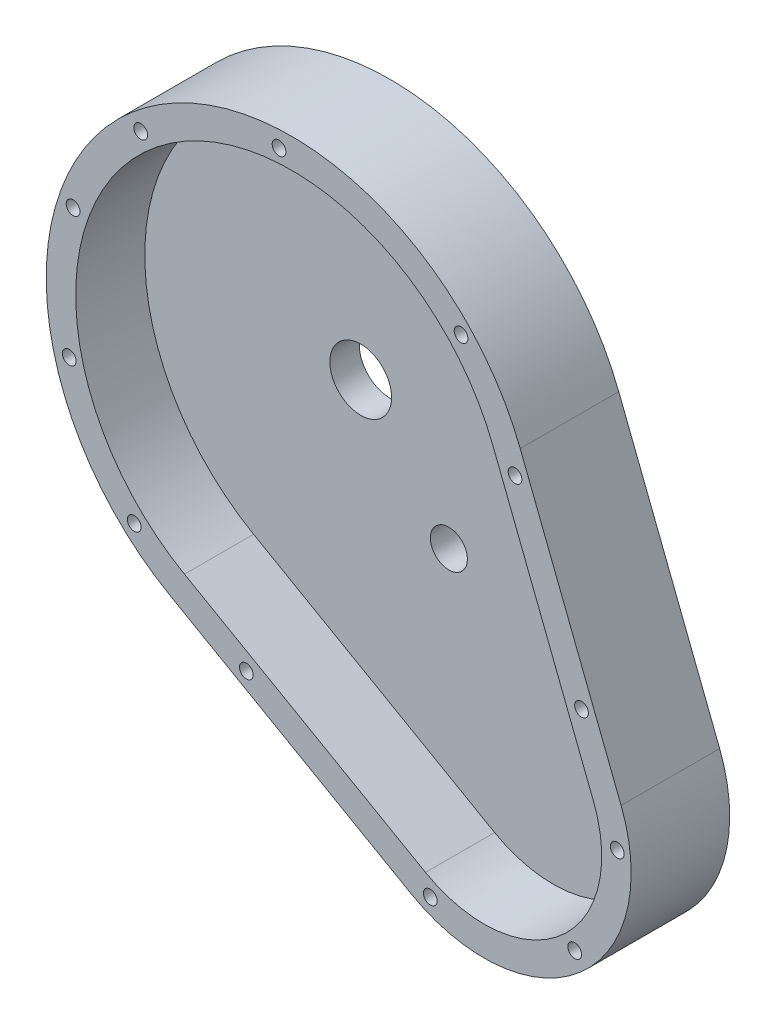
ISO-10303-21;
HEADER;
FILE_DESCRIPTION(('STEP AP214'),'2;1');
FILE_NAME('part.step','',(''),(''),'','','');
FILE_SCHEMA(('AUTOMOTIVE_DESIGN { 1 0 10303 214 1 1 1 1 }'));
ENDSEC;
DATA;
#1=APPLICATION_CONTEXT('core data for automotive mechanical design processes');
#2=APPLICATION_PROTOCOL_DEFINITION('international standard','automotive_design',2000,#1);
#3=PRODUCT_CONTEXT('',#1,'mechanical');
#4=PRODUCT('Part','Part','',(#3));
#5=PRODUCT_RELATED_PRODUCT_CATEGORY('part','',(#4));
#6=PRODUCT_DEFINITION_FORMATION('','',#4);
#7=PRODUCT_DEFINITION_CONTEXT('part definition',#1,'design');
#8=PRODUCT_DEFINITION('design','',#6,#7);
#9=PRODUCT_DEFINITION_SHAPE('','',#8);
#10=(LENGTH_UNIT() NAMED_UNIT(*) SI_UNIT(.MILLI.,.METRE.));
#11=(NAMED_UNIT(*) PLANE_ANGLE_UNIT() SI_UNIT($,.RADIAN.));
#12=(NAMED_UNIT(*) SI_UNIT($,.STERADIAN.) SOLID_ANGLE_UNIT());
#13=UNCERTAINTY_MEASURE_WITH_UNIT(LENGTH_MEASURE(1.E-05),#10,'distance_accuracy_value','');
#14=(GEOMETRIC_REPRESENTATION_CONTEXT(3) GLOBAL_UNCERTAINTY_ASSIGNED_CONTEXT((#13)) GLOBAL_UNIT_ASSIGNED_CONTEXT((#10,
#11,#12)) REPRESENTATION_CONTEXT('',''));
#15=CARTESIAN_POINT('',(0.,0.,0.));
#16=DIRECTION('',(0.,0.,1.));
#17=DIRECTION('',(1.,0.,0.));
#18=AXIS2_PLACEMENT_3D('',#15,#16,#17);
#19=CARTESIAN_POINT('',(15.7540834815016,27.5657641587872,12.7508));
#20=DIRECTION('',(0.,0.,-1.));
#21=DIRECTION('',(-1.,0.,0.));
#22=AXIS2_PLACEMENT_3D('',#19,#20,#21);
#23=CYLINDRICAL_SURFACE('',#22,31.75);
#24=CARTESIAN_POINT('',(15.7540834815016,27.5657641587872,0.));
#25=DIRECTION('',(0.,0.,1.));
#26=DIRECTION('',(1.,0.,0.));
#27=AXIS2_PLACEMENT_3D('',#24,#25,#26);
#28=CIRCLE('',#27,31.75);
#29=CARTESIAN_POINT('',(45.3334273140184,39.1037413834896,0.));
#30=VERTEX_POINT('',#29);
#31=CARTESIAN_POINT('',(0.,0.,0.));
#32=VERTEX_POINT('',#31);
#33=EDGE_CURVE('E173',#30,#32,#28,.T.);
#34=ORIENTED_EDGE('',*,*,#33,.T.);
#35=DIRECTION('',(0.,0.,-1.));
#36=VECTOR('',#35,1.);
#37=CARTESIAN_POINT('',(0.,0.,12.7508));
#38=LINE('',#37,#36);
#39=CARTESIAN_POINT('',(0.,0.,12.7508));
#40=VERTEX_POINT('',#39);
#41=EDGE_CURVE('E11',#40,#32,#38,.T.);
#42=ORIENTED_EDGE('',*,*,#41,.F.);
#43=CARTESIAN_POINT('',(15.7540834815016,27.5657641587872,12.7508));
#44=DIRECTION('',(0.,0.,1.));
#45=DIRECTION('',(1.,0.,0.));
#46=AXIS2_PLACEMENT_3D('',#43,#44,#45);
#47=CIRCLE('',#46,31.75);
#48=CARTESIAN_POINT('',(45.3334273140184,39.1037413834896,12.7508));
#49=VERTEX_POINT('',#48);
#50=EDGE_CURVE('E162',#49,#40,#47,.T.);
#51=ORIENTED_EDGE('',*,*,#50,.F.);
#52=DIRECTION('',(0.,0.,-1.));
#53=VECTOR('',#52,1.);
#54=CARTESIAN_POINT('',(45.3334273140184,39.1037413834896,12.7508));
#55=LINE('',#54,#53);
#56=EDGE_CURVE('E172',#49,#30,#55,.T.);
#57=ORIENTED_EDGE('',*,*,#56,.T.);
#58=EDGE_LOOP('',(#34,#42,#51,#57));
#59=FACE_BOUND('',#58,.T.);
#60=ADVANCED_FACE('F45',(#59),#23,.T.);
#61=CARTESIAN_POINT('',(0.,0.,12.7508));
#62=DIRECTION('',(0.496191605716585,0.868213044371252,0.));
#63=DIRECTION('',(-0.868213044371252,0.496191605716585,0.));
#64=AXIS2_PLACEMENT_3D('',#61,#62,#63);
#65=PLANE('',#64);
#66=DIRECTION('',(0.868213044371252,-0.496191605716584,0.));
#67=VECTOR('',#66,1.);
#68=CARTESIAN_POINT('',(0.,0.,0.));
#69=LINE('',#68,#67);
#70=CARTESIAN_POINT('',(31.1871020244281,-17.823710817838,0.));
#71=VERTEX_POINT('',#70);
#72=EDGE_CURVE('E177',#32,#71,#69,.T.);
#73=ORIENTED_EDGE('',*,*,#72,.T.);
#74=DIRECTION('',(0.,0.,-1.));
#75=VECTOR('',#74,1.);
#76=CARTESIAN_POINT('',(31.1871020244281,-17.823710817838,12.7508));
#77=LINE('',#76,#75);
#78=CARTESIAN_POINT('',(31.1871020244281,-17.823710817838,12.7508));
#79=VERTEX_POINT('',#78);
#80=EDGE_CURVE('E53',#79,#71,#77,.T.);
#81=ORIENTED_EDGE('',*,*,#80,.F.);
#82=DIRECTION('',(0.868213044371252,-0.496191605716584,0.));
#83=VECTOR('',#82,1.);
#84=CARTESIAN_POINT('',(0.,0.,12.7508));
#85=LINE('',#84,#83);
#86=EDGE_CURVE('E97',#40,#79,#85,.T.);
#87=ORIENTED_EDGE('',*,*,#86,.F.);
#88=ORIENTED_EDGE('',*,*,#41,.T.);
#89=EDGE_LOOP('',(#73,#81,#87,#88));
#90=FACE_BOUND('',#89,.T.);
#91=ADVANCED_FACE('F212',(#90),#65,.F.);
#92=CARTESIAN_POINT('',(40.639552113329,-1.28425232256561,12.7508));
#93=DIRECTION('',(0.,0.,-1.));
#94=DIRECTION('',(-1.,0.,0.));
#95=AXIS2_PLACEMENT_3D('',#92,#93,#94);
#96=CYLINDRICAL_SURFACE('',#95,19.05);
#97=CARTESIAN_POINT('',(40.639552113329,-1.28425232256561,0.));
#98=DIRECTION('',(0.,0.,1.));
#99=DIRECTION('',(1.,0.,0.));
#100=AXIS2_PLACEMENT_3D('',#97,#98,#99);
#101=CIRCLE('',#100,19.05);
#102=CARTESIAN_POINT('',(58.3871584128391,5.63853401225579,0.));
#103=VERTEX_POINT('',#102);
#104=EDGE_CURVE('E180',#71,#103,#101,.T.);
#105=ORIENTED_EDGE('',*,*,#104,.T.);
#106=DIRECTION('',(0.,0.,-1.));
#107=VECTOR('',#106,1.);
#108=CARTESIAN_POINT('',(58.3871584128391,5.63853401225579,12.7508));
#109=LINE('',#108,#107);
#110=CARTESIAN_POINT('',(58.3871584128391,5.63853401225579,12.7508));
#111=VERTEX_POINT('',#110);
#112=EDGE_CURVE('E187',#111,#103,#109,.T.);
#113=ORIENTED_EDGE('',*,*,#112,.F.);
#114=CARTESIAN_POINT('',(40.639552113329,-1.28425232256561,12.7508));
#115=DIRECTION('',(0.,0.,1.));
#116=DIRECTION('',(1.,0.,0.));
#117=AXIS2_PLACEMENT_3D('',#114,#115,#116);
#118=CIRCLE('',#117,19.05);
#119=EDGE_CURVE('E167',#79,#111,#118,.T.);
#120=ORIENTED_EDGE('',*,*,#119,.F.);
#121=ORIENTED_EDGE('',*,*,#80,.T.);
#122=EDGE_LOOP('',(#105,#113,#120,#121));
#123=FACE_BOUND('',#122,.T.);
#124=ADVANCED_FACE('F194',(#123),#96,.T.);
#125=CARTESIAN_POINT('',(58.3871584128391,5.63853401225578,12.7508));
#126=DIRECTION('',(-0.931632876614703,-0.363400857470939,0.));
#127=DIRECTION('',(0.363400857470939,-0.931632876614703,0.));
#128=AXIS2_PLACEMENT_3D('',#125,#126,#127);
#129=PLANE('',#128);
#130=DIRECTION('',(-0.363400857470939,0.931632876614703,0.));
#131=VECTOR('',#130,1.);
#132=CARTESIAN_POINT('',(58.3871584128391,5.63853401225578,0.));
#133=LINE('',#132,#131);
#134=EDGE_CURVE('E90',#103,#30,#133,.T.);
#135=ORIENTED_EDGE('',*,*,#134,.T.);
#136=ORIENTED_EDGE('',*,*,#56,.F.);
#137=DIRECTION('',(-0.363400857470939,0.931632876614703,0.));
#138=VECTOR('',#137,1.);
#139=CARTESIAN_POINT('',(58.3871584128391,5.63853401225578,12.7508));
#140=LINE('',#139,#138);
#141=EDGE_CURVE('E69',#111,#49,#140,.T.);
#142=ORIENTED_EDGE('',*,*,#141,.F.);
#143=ORIENTED_EDGE('',*,*,#112,.T.);
#144=EDGE_LOOP('',(#135,#136,#142,#143));
#145=FACE_BOUND('',#144,.T.);
#146=ADVANCED_FACE('F202',(#145),#129,.F.);
#147=CARTESIAN_POINT('',(15.7540834815016,27.5657641587872,12.7508));
#148=DIRECTION('',(0.,0.,1.));
#149=DIRECTION('',(1.,0.,0.));
#150=AXIS2_PLACEMENT_3D('',#147,#148,#149);
#151=PLANE('',#150);
#152=CARTESIAN_POINT('',(-3.77016974643415,50.098384989217,12.7508));
#153=DIRECTION('',(0.,0.,1.));
#154=DIRECTION('',(1.,0.,0.));
#155=AXIS2_PLACEMENT_3D('',#152,#153,#154);
#156=CIRCLE('',#155,0.888999999999987);
#157=CARTESIAN_POINT('',(-2.88116974643417,50.098384989217,12.7508));
#158=VERTEX_POINT('',#157);
#159=EDGE_CURVE('E504',#158,#158,#156,.T.);
#160=ORIENTED_EDGE('',*,*,#159,.F.);
#161=EDGE_LOOP('',(#160));
#162=FACE_BOUND('',#161,.T.);
#163=CARTESIAN_POINT('',(14.1273033168311,57.178704003256,12.7508));
#164=DIRECTION('',(0.,0.,1.));
#165=DIRECTION('',(1.,0.,0.));
#166=AXIS2_PLACEMENT_3D('',#163,#164,#165);
#167=CIRCLE('',#166,0.888999999999987);
#168=CARTESIAN_POINT('',(15.0163033168311,57.178704003256,12.7508));
#169=VERTEX_POINT('',#168);
#170=EDGE_CURVE('E515',#169,#169,#167,.T.);
#171=ORIENTED_EDGE('',*,*,#170,.F.);
#172=EDGE_LOOP('',(#171));
#173=FACE_BOUND('',#172,.T.);
#174=CARTESIAN_POINT('',(37.6791978149192,48.0332919434556,12.7508));
#175=DIRECTION('',(0.,0.,1.));
#176=DIRECTION('',(1.,0.,0.));
#177=AXIS2_PLACEMENT_3D('',#174,#175,#176);
#178=CIRCLE('',#177,0.888999999999987);
#179=CARTESIAN_POINT('',(38.5681978149191,48.0332919434556,12.7508));
#180=VERTEX_POINT('',#179);
#181=EDGE_CURVE('E523',#180,#180,#178,.T.);
#182=ORIENTED_EDGE('',*,*,#181,.F.);
#183=EDGE_LOOP('',(#182));
#184=FACE_BOUND('',#183,.T.);
#185=CARTESIAN_POINT('',(57.8876083341555,0.388645244818161,12.7508));
#186=DIRECTION('',(0.,0.,1.));
#187=DIRECTION('',(1.,0.,0.));
#188=AXIS2_PLACEMENT_3D('',#185,#186,#187);
#189=CIRCLE('',#188,0.888999999999987);
#190=CARTESIAN_POINT('',(58.7766083341554,0.388645244818161,12.7508));
#191=VERTEX_POINT('',#190);
#192=EDGE_CURVE('E531',#191,#191,#189,.T.);
#193=ORIENTED_EDGE('',*,*,#192,.F.);
#194=EDGE_LOOP('',(#193));
#195=FACE_BOUND('',#194,.T.);
#196=CARTESIAN_POINT('',(52.3806935454585,-13.624486137134,12.7508));
#197=DIRECTION('',(0.,0.,1.));
#198=DIRECTION('',(1.,0.,0.));
#199=AXIS2_PLACEMENT_3D('',#196,#197,#198);
#200=CIRCLE('',#199,0.888999999999987);
#201=CARTESIAN_POINT('',(53.2696935454585,-13.624486137134,12.7508));
#202=VERTEX_POINT('',#201);
#203=EDGE_CURVE('E539',#202,#202,#200,.T.);
#204=ORIENTED_EDGE('',*,*,#203,.F.);
#205=EDGE_LOOP('',(#204));
#206=FACE_BOUND('',#205,.T.);
#207=CARTESIAN_POINT('',(33.6965183695222,-16.9679701159858,12.7508));
#208=DIRECTION('',(0.,0.,1.));
#209=DIRECTION('',(1.,0.,0.));
#210=AXIS2_PLACEMENT_3D('',#207,#208,#209);
#211=CIRCLE('',#210,0.888999999999987);
#212=CARTESIAN_POINT('',(34.5855183695222,-16.9679701159858,12.7508));
#213=VERTEX_POINT('',#212);
#214=EDGE_CURVE('E547',#213,#213,#211,.T.);
#215=ORIENTED_EDGE('',*,*,#214,.F.);
#216=EDGE_LOOP('',(#215));
#217=FACE_BOUND('',#216,.T.);
#218=CARTESIAN_POINT('',(9.89877946122447,-3.54486531853684,12.7508));
#219=DIRECTION('',(0.,0.,1.));
#220=DIRECTION('',(1.,0.,0.));
#221=AXIS2_PLACEMENT_3D('',#218,#219,#220);
#222=CIRCLE('',#221,0.888999999999987);
#223=CARTESIAN_POINT('',(10.7877794612245,-3.54486531853684,12.7508));
#224=VERTEX_POINT('',#223);
#225=EDGE_CURVE('E555',#224,#224,#222,.T.);
#226=ORIENTED_EDGE('',*,*,#225,.F.);
#227=EDGE_LOOP('',(#226));
#228=FACE_BOUND('',#227,.T.);
#229=CARTESIAN_POINT('',(-4.60604074114709,5.74805338738934,12.7508));
#230=DIRECTION('',(0.,0.,1.));
#231=DIRECTION('',(1.,0.,0.));
#232=AXIS2_PLACEMENT_3D('',#229,#230,#231);
#233=CIRCLE('',#232,0.888999999999987);
#234=CARTESIAN_POINT('',(-3.71704074114711,5.74805338738934,12.7508));
#235=VERTEX_POINT('',#234);
#236=EDGE_CURVE('E563',#235,#235,#233,.T.);
#237=ORIENTED_EDGE('',*,*,#236,.F.);
#238=EDGE_LOOP('',(#237));
#239=FACE_BOUND('',#238,.T.);
#240=CARTESIAN_POINT('',(-13.0139195703184,20.154535825677,12.7508));
#241=DIRECTION('',(0.,0.,1.));
#242=DIRECTION('',(1.,0.,0.));
#243=AXIS2_PLACEMENT_3D('',#240,#241,#242);
#244=CIRCLE('',#243,0.888999999999987);
#245=CARTESIAN_POINT('',(-12.1249195703184,20.154535825677,12.7508));
#246=VERTEX_POINT('',#245);
#247=EDGE_CURVE('E571',#246,#246,#244,.T.);
#248=ORIENTED_EDGE('',*,*,#247,.F.);
#249=EDGE_LOOP('',(#248));
#250=FACE_BOUND('',#249,.T.);
#251=CARTESIAN_POINT('',(-12.522230749899,37.1669690121874,12.7508));
#252=DIRECTION('',(0.,0.,1.));
#253=DIRECTION('',(1.,0.,0.));
#254=AXIS2_PLACEMENT_3D('',#251,#252,#253);
#255=CIRCLE('',#254,0.888999999999987);
#256=CARTESIAN_POINT('',(-11.633230749899,37.1669690121874,12.7508));
#257=VERTEX_POINT('',#256);
#258=EDGE_CURVE('E579',#257,#257,#255,.T.);
#259=ORIENTED_EDGE('',*,*,#258,.F.);
#260=EDGE_LOOP('',(#259));
#261=FACE_BOUND('',#260,.T.);
#262=CARTESIAN_POINT('',(44.6611790648743,35.7410714329712,12.7508));
#263=DIRECTION('',(0.,0.,1.));
#264=DIRECTION('',(1.,0.,0.));
#265=AXIS2_PLACEMENT_3D('',#262,#263,#264);
#266=CIRCLE('',#265,0.888999999999987);
#267=CARTESIAN_POINT('',(45.5501790648743,35.7410714329712,12.7508));
#268=VERTEX_POINT('',#267);
#269=EDGE_CURVE('E587',#268,#268,#266,.T.);
#270=ORIENTED_EDGE('',*,*,#269,.F.);
#271=EDGE_LOOP('',(#270));
#272=FACE_BOUND('',#271,.T.);
#273=CARTESIAN_POINT('',(53.2657334222133,13.860918924309,12.7508));
#274=DIRECTION('',(0.,0.,1.));
#275=DIRECTION('',(1.,0.,0.));
#276=AXIS2_PLACEMENT_3D('',#273,#274,#275);
#277=CIRCLE('',#276,0.888999999999987);
#278=CARTESIAN_POINT('',(54.1547334222133,13.860918924309,12.7508));
#279=VERTEX_POINT('',#278);
#280=EDGE_CURVE('E595',#279,#279,#277,.T.);
#281=ORIENTED_EDGE('',*,*,#280,.F.);
#282=EDGE_LOOP('',(#281));
#283=FACE_BOUND('',#282,.T.);
#284=CARTESIAN_POINT('',(15.7540834815016,27.5657641587872,12.7508));
#285=DIRECTION('',(0.,0.,1.));
#286=DIRECTION('',(1.,0.,0.));
#287=AXIS2_PLACEMENT_3D('',#284,#285,#286);
#288=CIRCLE('',#287,27.94);
#289=CARTESIAN_POINT('',(41.7839060541164,37.7191841165253,12.7508));
#290=VERTEX_POINT('',#289);
#291=CARTESIAN_POINT('',(1.89049001778019,3.30789169905447,12.7508));
#292=VERTEX_POINT('',#291);
#293=EDGE_CURVE('E146',#290,#292,#288,.T.);
#294=ORIENTED_EDGE('',*,*,#293,.F.);
#295=DIRECTION('',(-0.363400857470939,0.931632876614703,0.));
#296=VECTOR('',#295,1.);
#297=CARTESIAN_POINT('',(54.8376371529371,4.2539767452915,12.7508));
#298=LINE('',#297,#296);
#299=CARTESIAN_POINT('',(54.8376371529371,4.25397674529151,12.7508));
#300=VERTEX_POINT('',#299);
#301=EDGE_CURVE('E159',#300,#290,#298,.T.);
#302=ORIENTED_EDGE('',*,*,#301,.F.);
#303=CARTESIAN_POINT('',(40.639552113329,-1.28425232256561,12.7508));
#304=DIRECTION('',(0.,0.,1.));
#305=DIRECTION('',(1.,0.,0.));
#306=AXIS2_PLACEMENT_3D('',#303,#304,#305);
#307=CIRCLE('',#306,15.24);
#308=CARTESIAN_POINT('',(33.0775920422083,-14.5158191187835,12.7508));
#309=VERTEX_POINT('',#308);
#310=EDGE_CURVE('E156',#309,#300,#307,.T.);
#311=ORIENTED_EDGE('',*,*,#310,.F.);
#312=DIRECTION('',(0.868213044371252,-0.496191605716585,0.));
#313=VECTOR('',#312,1.);
#314=CARTESIAN_POINT('',(1.89049001778019,3.30789169905447,12.7508));
#315=LINE('',#314,#313);
#316=EDGE_CURVE('E135',#292,#309,#315,.T.);
#317=ORIENTED_EDGE('',*,*,#316,.F.);
#318=EDGE_LOOP('',(#294,#302,#311,#317));
#319=FACE_BOUND('',#318,.T.);
#320=ORIENTED_EDGE('',*,*,#50,.T.);
#321=ORIENTED_EDGE('',*,*,#86,.T.);
#322=ORIENTED_EDGE('',*,*,#119,.T.);
#323=ORIENTED_EDGE('',*,*,#141,.T.);
#324=EDGE_LOOP('',(#320,#321,#322,#323));
#325=FACE_BOUND('',#324,.T.);
#326=ADVANCED_FACE('F204',(#162,#173,#184,#195,#206,#217,#228,#239,#250,#261,#272,#283,#319,
#325),#151,.T.);
#327=CARTESIAN_POINT('',(15.7540834815016,27.5657641587872,0.));
#328=DIRECTION('',(0.,0.,1.));
#329=DIRECTION('',(1.,0.,0.));
#330=AXIS2_PLACEMENT_3D('',#327,#328,#329);
#331=PLANE('',#330);
#332=CARTESIAN_POINT('',(27.1599232710891,14.3428399381672,0.));
#333=DIRECTION('',(0.,0.,1.));
#334=DIRECTION('',(1.,0.,0.));
#335=AXIS2_PLACEMENT_3D('',#332,#333,#334);
#336=CIRCLE('',#335,2.39395);
#337=CARTESIAN_POINT('',(29.5538732710891,14.3428399381672,0.));
#338=VERTEX_POINT('',#337);
#339=EDGE_CURVE('E490',#338,#338,#336,.T.);
#340=ORIENTED_EDGE('',*,*,#339,.T.);
#341=EDGE_LOOP('',(#340));
#342=FACE_BOUND('',#341,.T.);
#343=CARTESIAN_POINT('',(15.7540834815016,27.5657641587872,0.));
#344=DIRECTION('',(0.,0.,1.));
#345=DIRECTION('',(1.,0.,0.));
#346=AXIS2_PLACEMENT_3D('',#343,#344,#345);
#347=CIRCLE('',#346,3.99415);
#348=CARTESIAN_POINT('',(19.7482334815016,27.5657641587872,0.));
#349=VERTEX_POINT('',#348);
#350=EDGE_CURVE('E500',#349,#349,#347,.T.);
#351=ORIENTED_EDGE('',*,*,#350,.T.);
#352=EDGE_LOOP('',(#351));
#353=FACE_BOUND('',#352,.T.);
#354=CARTESIAN_POINT('',(-3.77016974643415,50.098384989217,0.));
#355=DIRECTION('',(0.,0.,1.));
#356=DIRECTION('',(1.,0.,0.));
#357=AXIS2_PLACEMENT_3D('',#354,#355,#356);
#358=CIRCLE('',#357,0.888999999999997);
#359=CARTESIAN_POINT('',(-2.88116974643416,50.098384989217,0.));
#360=VERTEX_POINT('',#359);
#361=EDGE_CURVE('E511',#360,#360,#358,.T.);
#362=ORIENTED_EDGE('',*,*,#361,.T.);
#363=EDGE_LOOP('',(#362));
#364=FACE_BOUND('',#363,.T.);
#365=CARTESIAN_POINT('',(14.1273033168311,57.178704003256,0.));
#366=DIRECTION('',(0.,0.,1.));
#367=DIRECTION('',(1.,0.,0.));
#368=AXIS2_PLACEMENT_3D('',#365,#366,#367);
#369=CIRCLE('',#368,0.888999999999997);
#370=CARTESIAN_POINT('',(15.0163033168311,57.178704003256,0.));
#371=VERTEX_POINT('',#370);
#372=EDGE_CURVE('E519',#371,#371,#369,.T.);
#373=ORIENTED_EDGE('',*,*,#372,.T.);
#374=EDGE_LOOP('',(#373));
#375=FACE_BOUND('',#374,.T.);
#376=CARTESIAN_POINT('',(37.6791978149192,48.0332919434556,0.));
#377=DIRECTION('',(0.,0.,1.));
#378=DIRECTION('',(1.,0.,0.));
#379=AXIS2_PLACEMENT_3D('',#376,#377,#378);
#380=CIRCLE('',#379,0.888999999999994);
#381=CARTESIAN_POINT('',(38.5681978149192,48.0332919434556,0.));
#382=VERTEX_POINT('',#381);
#383=EDGE_CURVE('E527',#382,#382,#380,.T.);
#384=ORIENTED_EDGE('',*,*,#383,.T.);
#385=EDGE_LOOP('',(#384));
#386=FACE_BOUND('',#385,.T.);
#387=CARTESIAN_POINT('',(57.8876083341555,0.388645244818161,0.));
#388=DIRECTION('',(0.,0.,1.));
#389=DIRECTION('',(1.,0.,0.));
#390=AXIS2_PLACEMENT_3D('',#387,#388,#389);
#391=CIRCLE('',#390,0.888999999999994);
#392=CARTESIAN_POINT('',(58.7766083341555,0.388645244818161,0.));
#393=VERTEX_POINT('',#392);
#394=EDGE_CURVE('E535',#393,#393,#391,.T.);
#395=ORIENTED_EDGE('',*,*,#394,.T.);
#396=EDGE_LOOP('',(#395));
#397=FACE_BOUND('',#396,.T.);
#398=CARTESIAN_POINT('',(52.3806935454585,-13.624486137134,0.));
#399=DIRECTION('',(0.,0.,1.));
#400=DIRECTION('',(1.,0.,0.));
#401=AXIS2_PLACEMENT_3D('',#398,#399,#400);
#402=CIRCLE('',#401,0.888999999999994);
#403=CARTESIAN_POINT('',(53.2696935454585,-13.624486137134,0.));
#404=VERTEX_POINT('',#403);
#405=EDGE_CURVE('E543',#404,#404,#402,.T.);
#406=ORIENTED_EDGE('',*,*,#405,.T.);
#407=EDGE_LOOP('',(#406));
#408=FACE_BOUND('',#407,.T.);
#409=CARTESIAN_POINT('',(33.6965183695222,-16.9679701159858,0.));
#410=DIRECTION('',(0.,0.,1.));
#411=DIRECTION('',(1.,0.,0.));
#412=AXIS2_PLACEMENT_3D('',#409,#410,#411);
#413=CIRCLE('',#412,0.888999999999994);
#414=CARTESIAN_POINT('',(34.5855183695222,-16.9679701159858,0.));
#415=VERTEX_POINT('',#414);
#416=EDGE_CURVE('E551',#415,#415,#413,.T.);
#417=ORIENTED_EDGE('',*,*,#416,.T.);
#418=EDGE_LOOP('',(#417));
#419=FACE_BOUND('',#418,.T.);
#420=CARTESIAN_POINT('',(9.89877946122447,-3.54486531853684,0.));
#421=DIRECTION('',(0.,0.,1.));
#422=DIRECTION('',(1.,0.,0.));
#423=AXIS2_PLACEMENT_3D('',#420,#421,#422);
#424=CIRCLE('',#423,0.888999999999997);
#425=CARTESIAN_POINT('',(10.7877794612245,-3.54486531853684,0.));
#426=VERTEX_POINT('',#425);
#427=EDGE_CURVE('E559',#426,#426,#424,.T.);
#428=ORIENTED_EDGE('',*,*,#427,.T.);
#429=EDGE_LOOP('',(#428));
#430=FACE_BOUND('',#429,.T.);
#431=CARTESIAN_POINT('',(-4.60604074114709,5.74805338738934,0.));
#432=DIRECTION('',(0.,0.,1.));
#433=DIRECTION('',(1.,0.,0.));
#434=AXIS2_PLACEMENT_3D('',#431,#432,#433);
#435=CIRCLE('',#434,0.888999999999997);
#436=CARTESIAN_POINT('',(-3.7170407411471,5.74805338738934,0.));
#437=VERTEX_POINT('',#436);
#438=EDGE_CURVE('E567',#437,#437,#435,.T.);
#439=ORIENTED_EDGE('',*,*,#438,.T.);
#440=EDGE_LOOP('',(#439));
#441=FACE_BOUND('',#440,.T.);
#442=CARTESIAN_POINT('',(-13.0139195703184,20.154535825677,0.));
#443=DIRECTION('',(0.,0.,1.));
#444=DIRECTION('',(1.,0.,0.));
#445=AXIS2_PLACEMENT_3D('',#442,#443,#444);
#446=CIRCLE('',#445,0.888999999999997);
#447=CARTESIAN_POINT('',(-12.1249195703184,20.154535825677,0.));
#448=VERTEX_POINT('',#447);
#449=EDGE_CURVE('E575',#448,#448,#446,.T.);
#450=ORIENTED_EDGE('',*,*,#449,.T.);
#451=EDGE_LOOP('',(#450));
#452=FACE_BOUND('',#451,.T.);
#453=CARTESIAN_POINT('',(-12.522230749899,37.1669690121874,0.));
#454=DIRECTION('',(0.,0.,1.));
#455=DIRECTION('',(1.,0.,0.));
#456=AXIS2_PLACEMENT_3D('',#453,#454,#455);
#457=CIRCLE('',#456,0.888999999999997);
#458=CARTESIAN_POINT('',(-11.633230749899,37.1669690121874,0.));
#459=VERTEX_POINT('',#458);
#460=EDGE_CURVE('E583',#459,#459,#457,.T.);
#461=ORIENTED_EDGE('',*,*,#460,.T.);
#462=EDGE_LOOP('',(#461));
#463=FACE_BOUND('',#462,.T.);
#464=CARTESIAN_POINT('',(44.6611790648743,35.7410714329712,0.));
#465=DIRECTION('',(0.,0.,1.));
#466=DIRECTION('',(1.,0.,0.));
#467=AXIS2_PLACEMENT_3D('',#464,#465,#466);
#468=CIRCLE('',#467,0.888999999999994);
#469=CARTESIAN_POINT('',(45.5501790648743,35.7410714329712,0.));
#470=VERTEX_POINT('',#469);
#471=EDGE_CURVE('E591',#470,#470,#468,.T.);
#472=ORIENTED_EDGE('',*,*,#471,.T.);
#473=EDGE_LOOP('',(#472));
#474=FACE_BOUND('',#473,.T.);
#475=CARTESIAN_POINT('',(53.2657334222133,13.860918924309,0.));
#476=DIRECTION('',(0.,0.,1.));
#477=DIRECTION('',(1.,0.,0.));
#478=AXIS2_PLACEMENT_3D('',#475,#476,#477);
#479=CIRCLE('',#478,0.888999999999994);
#480=CARTESIAN_POINT('',(54.1547334222133,13.860918924309,0.));
#481=VERTEX_POINT('',#480);
#482=EDGE_CURVE('E599',#481,#481,#479,.T.);
#483=ORIENTED_EDGE('',*,*,#482,.T.);
#484=EDGE_LOOP('',(#483));
#485=FACE_BOUND('',#484,.T.);
#486=ORIENTED_EDGE('',*,*,#33,.F.);
#487=ORIENTED_EDGE('',*,*,#134,.F.);
#488=ORIENTED_EDGE('',*,*,#104,.F.);
#489=ORIENTED_EDGE('',*,*,#72,.F.);
#490=EDGE_LOOP('',(#486,#487,#488,#489));
#491=FACE_BOUND('',#490,.T.);
#492=ADVANCED_FACE('F198',(#342,#353,#364,#375,#386,#397,#408,#419,#430,#441,#452,#463,#474,
#485,#491),#331,.F.);
#493=CARTESIAN_POINT('',(15.7540834815016,27.5657641587872,12.7508));
#494=DIRECTION('',(0.,0.,-1.));
#495=DIRECTION('',(-1.,0.,0.));
#496=AXIS2_PLACEMENT_3D('',#493,#494,#495);
#497=CYLINDRICAL_SURFACE('',#496,27.94);
#498=CARTESIAN_POINT('',(15.7540834815016,27.5657641587872,3.81));
#499=DIRECTION('',(0.,0.,1.));
#500=DIRECTION('',(1.,0.,0.));
#501=AXIS2_PLACEMENT_3D('',#498,#499,#500);
#502=CIRCLE('',#501,27.94);
#503=CARTESIAN_POINT('',(41.7839060541164,37.7191841165253,3.81));
#504=VERTEX_POINT('',#503);
#505=CARTESIAN_POINT('',(1.89049001778019,3.30789169905447,3.81));
#506=VERTEX_POINT('',#505);
#507=EDGE_CURVE('E125',#504,#506,#502,.T.);
#508=ORIENTED_EDGE('',*,*,#507,.F.);
#509=DIRECTION('',(0.,0.,-1.));
#510=VECTOR('',#509,1.);
#511=CARTESIAN_POINT('',(41.7839060541164,37.7191841165253,12.7508));
#512=LINE('',#511,#510);
#513=EDGE_CURVE('E150',#290,#504,#512,.T.);
#514=ORIENTED_EDGE('',*,*,#513,.F.);
#515=ORIENTED_EDGE('',*,*,#293,.T.);
#516=DIRECTION('',(0.,0.,1.));
#517=VECTOR('',#516,1.);
#518=CARTESIAN_POINT('',(1.89049001778019,3.30789169905447,12.7508));
#519=LINE('',#518,#517);
#520=EDGE_CURVE('E139',#292,#506,#519,.F.);
#521=ORIENTED_EDGE('',*,*,#520,.T.);
#522=EDGE_LOOP('',(#508,#514,#515,#521));
#523=FACE_BOUND('',#522,.T.);
#524=ADVANCED_FACE('F237',(#523),#497,.F.);
#525=CARTESIAN_POINT('',(1.89049001778019,3.30789169905447,12.7508));
#526=DIRECTION('',(0.496191605716585,0.868213044371252,0.));
#527=DIRECTION('',(-0.868213044371252,0.496191605716585,0.));
#528=AXIS2_PLACEMENT_3D('',#525,#526,#527);
#529=PLANE('',#528);
#530=DIRECTION('',(0.868213044371252,-0.496191605716585,0.));
#531=VECTOR('',#530,1.);
#532=CARTESIAN_POINT('',(1.89049001778019,3.30789169905447,3.81));
#533=LINE('',#532,#531);
#534=CARTESIAN_POINT('',(33.0775920422083,-14.5158191187835,3.81));
#535=VERTEX_POINT('',#534);
#536=EDGE_CURVE('E119',#506,#535,#533,.T.);
#537=ORIENTED_EDGE('',*,*,#536,.F.);
#538=ORIENTED_EDGE('',*,*,#520,.F.);
#539=ORIENTED_EDGE('',*,*,#316,.T.);
#540=DIRECTION('',(0.,0.,-1.));
#541=VECTOR('',#540,1.);
#542=CARTESIAN_POINT('',(33.0775920422083,-14.5158191187835,12.7508));
#543=LINE('',#542,#541);
#544=EDGE_CURVE('E132',#309,#535,#543,.T.);
#545=ORIENTED_EDGE('',*,*,#544,.T.);
#546=EDGE_LOOP('',(#537,#538,#539,#545));
#547=FACE_BOUND('',#546,.T.);
#548=ADVANCED_FACE('F133',(#547),#529,.T.);
#549=CARTESIAN_POINT('',(40.639552113329,-1.28425232256561,12.7508));
#550=DIRECTION('',(0.,0.,-1.));
#551=DIRECTION('',(-1.,0.,0.));
#552=AXIS2_PLACEMENT_3D('',#549,#550,#551);
#553=CYLINDRICAL_SURFACE('',#552,15.24);
#554=CARTESIAN_POINT('',(40.639552113329,-1.28425232256561,3.81));
#555=DIRECTION('',(0.,0.,1.));
#556=DIRECTION('',(1.,0.,0.));
#557=AXIS2_PLACEMENT_3D('',#554,#555,#556);
#558=CIRCLE('',#557,15.24);
#559=CARTESIAN_POINT('',(54.8376371529371,4.25397674529151,3.81));
#560=VERTEX_POINT('',#559);
#561=EDGE_CURVE('E123',#535,#560,#558,.T.);
#562=ORIENTED_EDGE('',*,*,#561,.F.);
#563=ORIENTED_EDGE('',*,*,#544,.F.);
#564=ORIENTED_EDGE('',*,*,#310,.T.);
#565=DIRECTION('',(0.,0.,1.));
#566=VECTOR('',#565,1.);
#567=CARTESIAN_POINT('',(54.8376371529371,4.25397674529151,12.7508));
#568=LINE('',#567,#566);
#569=EDGE_CURVE('E60',#300,#560,#568,.F.);
#570=ORIENTED_EDGE('',*,*,#569,.T.);
#571=EDGE_LOOP('',(#562,#563,#564,#570));
#572=FACE_BOUND('',#571,.T.);
#573=ADVANCED_FACE('F141',(#572),#553,.F.);
#574=CARTESIAN_POINT('',(54.8376371529371,4.2539767452915,12.7508));
#575=DIRECTION('',(-0.931632876614703,-0.363400857470939,0.));
#576=DIRECTION('',(0.363400857470939,-0.931632876614703,0.));
#577=AXIS2_PLACEMENT_3D('',#574,#575,#576);
#578=PLANE('',#577);
#579=DIRECTION('',(-0.363400857470939,0.931632876614703,0.));
#580=VECTOR('',#579,1.);
#581=CARTESIAN_POINT('',(54.8376371529371,4.2539767452915,3.81));
#582=LINE('',#581,#580);
#583=EDGE_CURVE('E143',#560,#504,#582,.T.);
#584=ORIENTED_EDGE('',*,*,#583,.F.);
#585=ORIENTED_EDGE('',*,*,#569,.F.);
#586=ORIENTED_EDGE('',*,*,#301,.T.);
#587=ORIENTED_EDGE('',*,*,#513,.T.);
#588=EDGE_LOOP('',(#584,#585,#586,#587));
#589=FACE_BOUND('',#588,.T.);
#590=ADVANCED_FACE('F263',(#589),#578,.T.);
#591=CARTESIAN_POINT('',(15.7540834815016,27.5657641587872,3.81));
#592=DIRECTION('',(0.,0.,1.));
#593=DIRECTION('',(1.,0.,0.));
#594=AXIS2_PLACEMENT_3D('',#591,#592,#593);
#595=PLANE('',#594);
#596=CARTESIAN_POINT('',(27.1599232710891,14.3428399381672,3.81));
#597=DIRECTION('',(0.,0.,1.));
#598=DIRECTION('',(1.,0.,0.));
#599=AXIS2_PLACEMENT_3D('',#596,#597,#598);
#600=CIRCLE('',#599,2.39395);
#601=CARTESIAN_POINT('',(29.5538732710891,14.3428399381672,3.81));
#602=VERTEX_POINT('',#601);
#603=EDGE_CURVE('E493',#602,#602,#600,.T.);
#604=ORIENTED_EDGE('',*,*,#603,.F.);
#605=EDGE_LOOP('',(#604));
#606=FACE_BOUND('',#605,.T.);
#607=CARTESIAN_POINT('',(15.7540834815016,27.5657641587872,3.81));
#608=DIRECTION('',(0.,0.,1.));
#609=DIRECTION('',(1.,0.,0.));
#610=AXIS2_PLACEMENT_3D('',#607,#608,#609);
#611=CIRCLE('',#610,3.99415);
#612=CARTESIAN_POINT('',(19.7482334815016,27.5657641587872,3.81));
#613=VERTEX_POINT('',#612);
#614=EDGE_CURVE('E497',#613,#613,#611,.T.);
#615=ORIENTED_EDGE('',*,*,#614,.F.);
#616=EDGE_LOOP('',(#615));
#617=FACE_BOUND('',#616,.T.);
#618=ORIENTED_EDGE('',*,*,#507,.T.);
#619=ORIENTED_EDGE('',*,*,#536,.T.);
#620=ORIENTED_EDGE('',*,*,#561,.T.);
#621=ORIENTED_EDGE('',*,*,#583,.T.);
#622=EDGE_LOOP('',(#618,#619,#620,#621));
#623=FACE_BOUND('',#622,.T.);
#624=ADVANCED_FACE('F121',(#606,#617,#623),#595,.T.);
#625=CARTESIAN_POINT('',(53.2657334222133,13.860918924309,12.7508));
#626=DIRECTION('',(0.,0.,1.));
#627=DIRECTION('',(1.,0.,0.));
#628=AXIS2_PLACEMENT_3D('',#625,#626,#627);
#629=CYLINDRICAL_SURFACE('',#628,0.88899999999999);
#630=ORIENTED_EDGE('',*,*,#482,.F.);
#631=EDGE_LOOP('',(#630));
#632=FACE_BOUND('',#631,.T.);
#633=ORIENTED_EDGE('',*,*,#280,.T.);
#634=EDGE_LOOP('',(#633));
#635=FACE_BOUND('',#634,.T.);
#636=ADVANCED_FACE('F286',(#632,#635),#629,.F.);
#637=CARTESIAN_POINT('',(44.6611790648743,35.7410714329712,12.7508));
#638=DIRECTION('',(0.,0.,1.));
#639=DIRECTION('',(1.,0.,0.));
#640=AXIS2_PLACEMENT_3D('',#637,#638,#639);
#641=CYLINDRICAL_SURFACE('',#640,0.88899999999999);
#642=ORIENTED_EDGE('',*,*,#471,.F.);
#643=EDGE_LOOP('',(#642));
#644=FACE_BOUND('',#643,.T.);
#645=ORIENTED_EDGE('',*,*,#269,.T.);
#646=EDGE_LOOP('',(#645));
#647=FACE_BOUND('',#646,.T.);
#648=ADVANCED_FACE('F291',(#644,#647),#641,.F.);
#649=CARTESIAN_POINT('',(-12.522230749899,37.1669690121874,12.7508));
#650=DIRECTION('',(0.,0.,1.));
#651=DIRECTION('',(1.,0.,0.));
#652=AXIS2_PLACEMENT_3D('',#649,#650,#651);
#653=CYLINDRICAL_SURFACE('',#652,0.888999999999992);
#654=ORIENTED_EDGE('',*,*,#460,.F.);
#655=EDGE_LOOP('',(#654));
#656=FACE_BOUND('',#655,.T.);
#657=ORIENTED_EDGE('',*,*,#258,.T.);
#658=EDGE_LOOP('',(#657));
#659=FACE_BOUND('',#658,.T.);
#660=ADVANCED_FACE('F302',(#656,#659),#653,.F.);
#661=CARTESIAN_POINT('',(-13.0139195703184,20.154535825677,12.7508));
#662=DIRECTION('',(0.,0.,1.));
#663=DIRECTION('',(1.,0.,0.));
#664=AXIS2_PLACEMENT_3D('',#661,#662,#663);
#665=CYLINDRICAL_SURFACE('',#664,0.888999999999992);
#666=ORIENTED_EDGE('',*,*,#449,.F.);
#667=EDGE_LOOP('',(#666));
#668=FACE_BOUND('',#667,.T.);
#669=ORIENTED_EDGE('',*,*,#247,.T.);
#670=EDGE_LOOP('',(#669));
#671=FACE_BOUND('',#670,.T.);
#672=ADVANCED_FACE('F313',(#668,#671),#665,.F.);
#673=CARTESIAN_POINT('',(-4.60604074114709,5.74805338738934,12.7508));
#674=DIRECTION('',(0.,0.,1.));
#675=DIRECTION('',(1.,0.,0.));
#676=AXIS2_PLACEMENT_3D('',#673,#674,#675);
#677=CYLINDRICAL_SURFACE('',#676,0.888999999999992);
#678=ORIENTED_EDGE('',*,*,#438,.F.);
#679=EDGE_LOOP('',(#678));
#680=FACE_BOUND('',#679,.T.);
#681=ORIENTED_EDGE('',*,*,#236,.T.);
#682=EDGE_LOOP('',(#681));
#683=FACE_BOUND('',#682,.T.);
#684=ADVANCED_FACE('F324',(#680,#683),#677,.F.);
#685=CARTESIAN_POINT('',(9.89877946122447,-3.54486531853684,12.7508));
#686=DIRECTION('',(0.,0.,1.));
#687=DIRECTION('',(1.,0.,0.));
#688=AXIS2_PLACEMENT_3D('',#685,#686,#687);
#689=CYLINDRICAL_SURFACE('',#688,0.888999999999992);
#690=ORIENTED_EDGE('',*,*,#427,.F.);
#691=EDGE_LOOP('',(#690));
#692=FACE_BOUND('',#691,.T.);
#693=ORIENTED_EDGE('',*,*,#225,.T.);
#694=EDGE_LOOP('',(#693));
#695=FACE_BOUND('',#694,.T.);
#696=ADVANCED_FACE('F335',(#692,#695),#689,.F.);
#697=CARTESIAN_POINT('',(33.6965183695222,-16.9679701159858,12.7508));
#698=DIRECTION('',(0.,0.,1.));
#699=DIRECTION('',(1.,0.,0.));
#700=AXIS2_PLACEMENT_3D('',#697,#698,#699);
#701=CYLINDRICAL_SURFACE('',#700,0.88899999999999);
#702=ORIENTED_EDGE('',*,*,#416,.F.);
#703=EDGE_LOOP('',(#702));
#704=FACE_BOUND('',#703,.T.);
#705=ORIENTED_EDGE('',*,*,#214,.T.);
#706=EDGE_LOOP('',(#705));
#707=FACE_BOUND('',#706,.T.);
#708=ADVANCED_FACE('F346',(#704,#707),#701,.F.);
#709=CARTESIAN_POINT('',(52.3806935454585,-13.624486137134,12.7508));
#710=DIRECTION('',(0.,0.,1.));
#711=DIRECTION('',(1.,0.,0.));
#712=AXIS2_PLACEMENT_3D('',#709,#710,#711);
#713=CYLINDRICAL_SURFACE('',#712,0.88899999999999);
#714=ORIENTED_EDGE('',*,*,#405,.F.);
#715=EDGE_LOOP('',(#714));
#716=FACE_BOUND('',#715,.T.);
#717=ORIENTED_EDGE('',*,*,#203,.T.);
#718=EDGE_LOOP('',(#717));
#719=FACE_BOUND('',#718,.T.);
#720=ADVANCED_FACE('F357',(#716,#719),#713,.F.);
#721=CARTESIAN_POINT('',(57.8876083341555,0.388645244818161,12.7508));
#722=DIRECTION('',(0.,0.,1.));
#723=DIRECTION('',(1.,0.,0.));
#724=AXIS2_PLACEMENT_3D('',#721,#722,#723);
#725=CYLINDRICAL_SURFACE('',#724,0.88899999999999);
#726=ORIENTED_EDGE('',*,*,#394,.F.);
#727=EDGE_LOOP('',(#726));
#728=FACE_BOUND('',#727,.T.);
#729=ORIENTED_EDGE('',*,*,#192,.T.);
#730=EDGE_LOOP('',(#729));
#731=FACE_BOUND('',#730,.T.);
#732=ADVANCED_FACE('F368',(#728,#731),#725,.F.);
#733=CARTESIAN_POINT('',(37.6791978149192,48.0332919434556,12.7508));
#734=DIRECTION('',(0.,0.,1.));
#735=DIRECTION('',(1.,0.,0.));
#736=AXIS2_PLACEMENT_3D('',#733,#734,#735);
#737=CYLINDRICAL_SURFACE('',#736,0.88899999999999);
#738=ORIENTED_EDGE('',*,*,#383,.F.);
#739=EDGE_LOOP('',(#738));
#740=FACE_BOUND('',#739,.T.);
#741=ORIENTED_EDGE('',*,*,#181,.T.);
#742=EDGE_LOOP('',(#741));
#743=FACE_BOUND('',#742,.T.);
#744=ADVANCED_FACE('F379',(#740,#743),#737,.F.);
#745=CARTESIAN_POINT('',(14.1273033168311,57.178704003256,12.7508));
#746=DIRECTION('',(0.,0.,1.));
#747=DIRECTION('',(1.,0.,0.));
#748=AXIS2_PLACEMENT_3D('',#745,#746,#747);
#749=CYLINDRICAL_SURFACE('',#748,0.888999999999992);
#750=ORIENTED_EDGE('',*,*,#372,.F.);
#751=EDGE_LOOP('',(#750));
#752=FACE_BOUND('',#751,.T.);
#753=ORIENTED_EDGE('',*,*,#170,.T.);
#754=EDGE_LOOP('',(#753));
#755=FACE_BOUND('',#754,.T.);
#756=ADVANCED_FACE('F390',(#752,#755),#749,.F.);
#757=CARTESIAN_POINT('',(-3.77016974643415,50.098384989217,12.7508));
#758=DIRECTION('',(0.,0.,1.));
#759=DIRECTION('',(1.,0.,0.));
#760=AXIS2_PLACEMENT_3D('',#757,#758,#759);
#761=CYLINDRICAL_SURFACE('',#760,0.888999999999992);
#762=ORIENTED_EDGE('',*,*,#361,.F.);
#763=EDGE_LOOP('',(#762));
#764=FACE_BOUND('',#763,.T.);
#765=ORIENTED_EDGE('',*,*,#159,.T.);
#766=EDGE_LOOP('',(#765));
#767=FACE_BOUND('',#766,.T.);
#768=ADVANCED_FACE('F401',(#764,#767),#761,.F.);
#769=CARTESIAN_POINT('',(15.7540834815016,27.5657641587872,0.));
#770=DIRECTION('',(0.,0.,1.));
#771=DIRECTION('',(1.,0.,0.));
#772=AXIS2_PLACEMENT_3D('',#769,#770,#771);
#773=CYLINDRICAL_SURFACE('',#772,3.99415);
#774=CARTESIAN_POINT('',(19.7482334815016,27.5657641587872,0.));
#775=CARTESIAN_POINT('',(19.7482334815016,27.5657641587872,0.0396874999999999));
#776=CARTESIAN_POINT('',(19.7482334815016,27.5657641587872,0.079375));
#777=CARTESIAN_POINT('',(19.7482334815016,27.5657641587872,0.15875));
#778=CARTESIAN_POINT('',(19.7482334815016,27.5657641587872,0.1984375));
#779=CARTESIAN_POINT('',(19.7482334815016,27.5657641587872,0.2778125));
#780=CARTESIAN_POINT('',(19.7482334815016,27.5657641587872,0.3175));
#781=CARTESIAN_POINT('',(19.7482334815016,27.5657641587872,0.396875));
#782=CARTESIAN_POINT('',(19.7482334815016,27.5657641587872,0.4365625));
#783=CARTESIAN_POINT('',(19.7482334815016,27.5657641587872,0.5159375));
#784=CARTESIAN_POINT('',(19.7482334815016,27.5657641587872,0.555625));
#785=CARTESIAN_POINT('',(19.7482334815016,27.5657641587872,0.635));
#786=CARTESIAN_POINT('',(19.7482334815016,27.5657641587872,0.6746875));
#787=CARTESIAN_POINT('',(19.7482334815016,27.5657641587872,0.7540625));
#788=CARTESIAN_POINT('',(19.7482334815016,27.5657641587872,0.79375));
#789=CARTESIAN_POINT('',(19.7482334815016,27.5657641587872,0.873125));
#790=CARTESIAN_POINT('',(19.7482334815016,27.5657641587872,0.9128125));
#791=CARTESIAN_POINT('',(19.7482334815016,27.5657641587872,0.9921875));
#792=CARTESIAN_POINT('',(19.7482334815016,27.5657641587872,1.031875));
#793=CARTESIAN_POINT('',(19.7482334815016,27.5657641587872,1.11125));
#794=CARTESIAN_POINT('',(19.7482334815016,27.5657641587872,1.1509375));
#795=CARTESIAN_POINT('',(19.7482334815016,27.5657641587872,1.2303125));
#796=CARTESIAN_POINT('',(19.7482334815016,27.5657641587872,1.27));
#797=CARTESIAN_POINT('',(19.7482334815016,27.5657641587872,1.349375));
#798=CARTESIAN_POINT('',(19.7482334815016,27.5657641587872,1.3890625));
#799=CARTESIAN_POINT('',(19.7482334815016,27.5657641587872,1.4684375));
#800=CARTESIAN_POINT('',(19.7482334815016,27.5657641587872,1.508125));
#801=CARTESIAN_POINT('',(19.7482334815016,27.5657641587872,1.5875));
#802=CARTESIAN_POINT('',(19.7482334815016,27.5657641587872,1.6271875));
#803=CARTESIAN_POINT('',(19.7482334815016,27.5657641587872,1.7065625));
#804=CARTESIAN_POINT('',(19.7482334815016,27.5657641587872,1.74625));
#805=CARTESIAN_POINT('',(19.7482334815016,27.5657641587872,1.825625));
#806=CARTESIAN_POINT('',(19.7482334815016,27.5657641587872,1.8653125));
#807=CARTESIAN_POINT('',(19.7482334815016,27.5657641587872,1.9446875));
#808=CARTESIAN_POINT('',(19.7482334815016,27.5657641587872,1.984375));
#809=CARTESIAN_POINT('',(19.7482334815016,27.5657641587872,2.06375));
#810=CARTESIAN_POINT('',(19.7482334815016,27.5657641587872,2.1034375));
#811=CARTESIAN_POINT('',(19.7482334815016,27.5657641587872,2.1828125));
#812=CARTESIAN_POINT('',(19.7482334815016,27.5657641587872,2.2225));
#813=CARTESIAN_POINT('',(19.7482334815016,27.5657641587872,2.301875));
#814=CARTESIAN_POINT('',(19.7482334815016,27.5657641587872,2.3415625));
#815=CARTESIAN_POINT('',(19.7482334815016,27.5657641587872,2.4209375));
#816=CARTESIAN_POINT('',(19.7482334815016,27.5657641587872,2.460625));
#817=CARTESIAN_POINT('',(19.7482334815016,27.5657641587872,2.54));
#818=CARTESIAN_POINT('',(19.7482334815016,27.5657641587872,2.5796875));
#819=CARTESIAN_POINT('',(19.7482334815016,27.5657641587872,2.6590625));
#820=CARTESIAN_POINT('',(19.7482334815016,27.5657641587872,2.69875));
#821=CARTESIAN_POINT('',(19.7482334815016,27.5657641587872,2.778125));
#822=CARTESIAN_POINT('',(19.7482334815016,27.5657641587872,2.8178125));
#823=CARTESIAN_POINT('',(19.7482334815016,27.5657641587872,2.8971875));
#824=CARTESIAN_POINT('',(19.7482334815016,27.5657641587872,2.936875));
#825=CARTESIAN_POINT('',(19.7482334815016,27.5657641587872,3.01625));
#826=CARTESIAN_POINT('',(19.7482334815016,27.5657641587872,3.0559375));
#827=CARTESIAN_POINT('',(19.7482334815016,27.5657641587872,3.1353125));
#828=CARTESIAN_POINT('',(19.7482334815016,27.5657641587872,3.175));
#829=CARTESIAN_POINT('',(19.7482334815016,27.5657641587872,3.254375));
#830=CARTESIAN_POINT('',(19.7482334815016,27.5657641587872,3.2940625));
#831=CARTESIAN_POINT('',(19.7482334815016,27.5657641587872,3.3734375));
#832=CARTESIAN_POINT('',(19.7482334815016,27.5657641587872,3.413125));
#833=CARTESIAN_POINT('',(19.7482334815016,27.5657641587872,3.4925));
#834=CARTESIAN_POINT('',(19.7482334815016,27.5657641587872,3.5321875));
#835=CARTESIAN_POINT('',(19.7482334815016,27.5657641587872,3.6115625));
#836=CARTESIAN_POINT('',(19.7482334815016,27.5657641587872,3.65125));
#837=CARTESIAN_POINT('',(19.7482334815016,27.5657641587872,3.730625));
#838=CARTESIAN_POINT('',(19.7482334815016,27.5657641587872,3.7703125));
#839=CARTESIAN_POINT('',(19.7482334815016,27.5657641587872,3.81));
#840=B_SPLINE_CURVE_WITH_KNOTS('',3,(#774,#775,#776,#777,#778,#779,#780,#781,#782,#783,#784,
#785,#786,#787,#788,#789,#790,#791,#792,#793,#794,#795,#796,#797,#798,#799,#800,#801,#802,#803,
#804,#805,#806,#807,#808,#809,#810,#811,#812,#813,#814,#815,#816,#817,#818,#819,#820,#821,#822,
#823,#824,#825,#826,#827,#828,#829,#830,#831,#832,#833,#834,#835,#836,#837,#838,#839),
.UNSPECIFIED.,.F.,.F.,(4,2,2,2,2,2,2,2,2,2,2,2,2,2,2,2,2,2,2,2,2,2,2,2,2,2,2,2,2,2,2,2,4),(0.,
0.1190625,0.238125,0.3571875,0.47625,0.5953125,0.714375,0.8334375,0.9525,1.0715625,1.190625,
1.3096875,1.42875,1.5478125,1.666875,1.7859375,1.905,2.0240625,2.143125,2.2621875,2.38125,
2.5003125,2.619375,2.7384375,2.8575,2.9765625,3.095625,3.2146875,3.33375,3.4528125,3.571875,
3.6909375,3.81),.UNSPECIFIED.);
#841=EDGE_CURVE('BSEAM412',#349,#613,#840,.T.);
#842=ORIENTED_EDGE('',*,*,#350,.F.);
#843=ORIENTED_EDGE('',*,*,#614,.T.);
#844=ORIENTED_EDGE('',*,*,#841,.T.);
#845=ORIENTED_EDGE('',*,*,#841,.F.);
#846=EDGE_LOOP('',(#842,#844,#843,#845));
#847=FACE_BOUND('',#846,.T.);
#848=ADVANCED_FACE('F412',(#847),#773,.F.);
#849=CARTESIAN_POINT('',(27.1599232710891,14.3428399381672,0.));
#850=DIRECTION('',(0.,0.,1.));
#851=DIRECTION('',(1.,0.,0.));
#852=AXIS2_PLACEMENT_3D('',#849,#850,#851);
#853=CYLINDRICAL_SURFACE('',#852,2.39395);
#854=CARTESIAN_POINT('',(29.5538732710891,14.3428399381672,0.));
#855=CARTESIAN_POINT('',(29.5538732710891,14.3428399381672,0.0396874999999999));
#856=CARTESIAN_POINT('',(29.5538732710891,14.3428399381672,0.079375));
#857=CARTESIAN_POINT('',(29.5538732710891,14.3428399381672,0.15875));
#858=CARTESIAN_POINT('',(29.5538732710891,14.3428399381672,0.1984375));
#859=CARTESIAN_POINT('',(29.5538732710891,14.3428399381672,0.2778125));
#860=CARTESIAN_POINT('',(29.5538732710891,14.3428399381672,0.3175));
#861=CARTESIAN_POINT('',(29.5538732710891,14.3428399381672,0.396875));
#862=CARTESIAN_POINT('',(29.5538732710891,14.3428399381672,0.4365625));
#863=CARTESIAN_POINT('',(29.5538732710891,14.3428399381672,0.5159375));
#864=CARTESIAN_POINT('',(29.5538732710891,14.3428399381672,0.555625));
#865=CARTESIAN_POINT('',(29.5538732710891,14.3428399381672,0.635));
#866=CARTESIAN_POINT('',(29.5538732710891,14.3428399381672,0.6746875));
#867=CARTESIAN_POINT('',(29.5538732710891,14.3428399381672,0.7540625));
#868=CARTESIAN_POINT('',(29.5538732710891,14.3428399381672,0.79375));
#869=CARTESIAN_POINT('',(29.5538732710891,14.3428399381672,0.873125));
#870=CARTESIAN_POINT('',(29.5538732710891,14.3428399381672,0.9128125));
#871=CARTESIAN_POINT('',(29.5538732710891,14.3428399381672,0.9921875));
#872=CARTESIAN_POINT('',(29.5538732710891,14.3428399381672,1.031875));
#873=CARTESIAN_POINT('',(29.5538732710891,14.3428399381672,1.11125));
#874=CARTESIAN_POINT('',(29.5538732710891,14.3428399381672,1.1509375));
#875=CARTESIAN_POINT('',(29.5538732710891,14.3428399381672,1.2303125));
#876=CARTESIAN_POINT('',(29.5538732710891,14.3428399381672,1.27));
#877=CARTESIAN_POINT('',(29.5538732710891,14.3428399381672,1.349375));
#878=CARTESIAN_POINT('',(29.5538732710891,14.3428399381672,1.3890625));
#879=CARTESIAN_POINT('',(29.5538732710891,14.3428399381672,1.4684375));
#880=CARTESIAN_POINT('',(29.5538732710891,14.3428399381672,1.508125));
#881=CARTESIAN_POINT('',(29.5538732710891,14.3428399381672,1.5875));
#882=CARTESIAN_POINT('',(29.5538732710891,14.3428399381672,1.6271875));
#883=CARTESIAN_POINT('',(29.5538732710891,14.3428399381672,1.7065625));
#884=CARTESIAN_POINT('',(29.5538732710891,14.3428399381672,1.74625));
#885=CARTESIAN_POINT('',(29.5538732710891,14.3428399381672,1.825625));
#886=CARTESIAN_POINT('',(29.5538732710891,14.3428399381672,1.8653125));
#887=CARTESIAN_POINT('',(29.5538732710891,14.3428399381672,1.9446875));
#888=CARTESIAN_POINT('',(29.5538732710891,14.3428399381672,1.984375));
#889=CARTESIAN_POINT('',(29.5538732710891,14.3428399381672,2.06375));
#890=CARTESIAN_POINT('',(29.5538732710891,14.3428399381672,2.1034375));
#891=CARTESIAN_POINT('',(29.5538732710891,14.3428399381672,2.1828125));
#892=CARTESIAN_POINT('',(29.5538732710891,14.3428399381672,2.2225));
#893=CARTESIAN_POINT('',(29.5538732710891,14.3428399381672,2.301875));
#894=CARTESIAN_POINT('',(29.5538732710891,14.3428399381672,2.3415625));
#895=CARTESIAN_POINT('',(29.5538732710891,14.3428399381672,2.4209375));
#896=CARTESIAN_POINT('',(29.5538732710891,14.3428399381672,2.460625));
#897=CARTESIAN_POINT('',(29.5538732710891,14.3428399381672,2.54));
#898=CARTESIAN_POINT('',(29.5538732710891,14.3428399381672,2.5796875));
#899=CARTESIAN_POINT('',(29.5538732710891,14.3428399381672,2.6590625));
#900=CARTESIAN_POINT('',(29.5538732710891,14.3428399381672,2.69875));
#901=CARTESIAN_POINT('',(29.5538732710891,14.3428399381672,2.778125));
#902=CARTESIAN_POINT('',(29.5538732710891,14.3428399381672,2.8178125));
#903=CARTESIAN_POINT('',(29.5538732710891,14.3428399381672,2.8971875));
#904=CARTESIAN_POINT('',(29.5538732710891,14.3428399381672,2.936875));
#905=CARTESIAN_POINT('',(29.5538732710891,14.3428399381672,3.01625));
#906=CARTESIAN_POINT('',(29.5538732710891,14.3428399381672,3.0559375));
#907=CARTESIAN_POINT('',(29.5538732710891,14.3428399381672,3.1353125));
#908=CARTESIAN_POINT('',(29.5538732710891,14.3428399381672,3.175));
#909=CARTESIAN_POINT('',(29.5538732710891,14.3428399381672,3.254375));
#910=CARTESIAN_POINT('',(29.5538732710891,14.3428399381672,3.2940625));
#911=CARTESIAN_POINT('',(29.5538732710891,14.3428399381672,3.3734375));
#912=CARTESIAN_POINT('',(29.5538732710891,14.3428399381672,3.413125));
#913=CARTESIAN_POINT('',(29.5538732710891,14.3428399381672,3.4925));
#914=CARTESIAN_POINT('',(29.5538732710891,14.3428399381672,3.5321875));
#915=CARTESIAN_POINT('',(29.5538732710891,14.3428399381672,3.6115625));
#916=CARTESIAN_POINT('',(29.5538732710891,14.3428399381672,3.65125));
#917=CARTESIAN_POINT('',(29.5538732710891,14.3428399381672,3.730625));
#918=CARTESIAN_POINT('',(29.5538732710891,14.3428399381672,3.7703125));
#919=CARTESIAN_POINT('',(29.5538732710891,14.3428399381672,3.81));
#920=B_SPLINE_CURVE_WITH_KNOTS('',3,(#854,#855,#856,#857,#858,#859,#860,#861,#862,#863,#864,
#865,#866,#867,#868,#869,#870,#871,#872,#873,#874,#875,#876,#877,#878,#879,#880,#881,#882,#883,
#884,#885,#886,#887,#888,#889,#890,#891,#892,#893,#894,#895,#896,#897,#898,#899,#900,#901,#902,
#903,#904,#905,#906,#907,#908,#909,#910,#911,#912,#913,#914,#915,#916,#917,#918,#919),
.UNSPECIFIED.,.F.,.F.,(4,2,2,2,2,2,2,2,2,2,2,2,2,2,2,2,2,2,2,2,2,2,2,2,2,2,2,2,2,2,2,2,4),(0.,
0.1190625,0.238125,0.3571875,0.47625,0.5953125,0.714375,0.8334375,0.9525,1.0715625,1.190625,
1.3096875,1.42875,1.5478125,1.666875,1.7859375,1.905,2.0240625,2.143125,2.2621875,2.38125,
2.5003125,2.619375,2.7384375,2.8575,2.9765625,3.095625,3.2146875,3.33375,3.4528125,3.571875,
3.6909375,3.81),.UNSPECIFIED.);
#921=EDGE_CURVE('BSEAM423',#338,#602,#920,.T.);
#922=ORIENTED_EDGE('',*,*,#339,.F.);
#923=ORIENTED_EDGE('',*,*,#603,.T.);
#924=ORIENTED_EDGE('',*,*,#921,.T.);
#925=ORIENTED_EDGE('',*,*,#921,.F.);
#926=EDGE_LOOP('',(#922,#924,#923,#925));
#927=FACE_BOUND('',#926,.T.);
#928=ADVANCED_FACE('F423',(#927),#853,.F.);
#929=CLOSED_SHELL('',(#60,#91,#124,#146,#326,#492,#524,#548,#573,#590,#624,#636,#648,#660,#672,
#684,#696,#708,#720,#732,#744,#756,#768,#848,#928));
#930=MANIFOLD_SOLID_BREP('B2',#929);
#931=ADVANCED_BREP_SHAPE_REPRESENTATION('',(#18,#930),#14);
#932=SHAPE_DEFINITION_REPRESENTATION(#9,#931);
ENDSEC;
END-ISO-10303-21;
